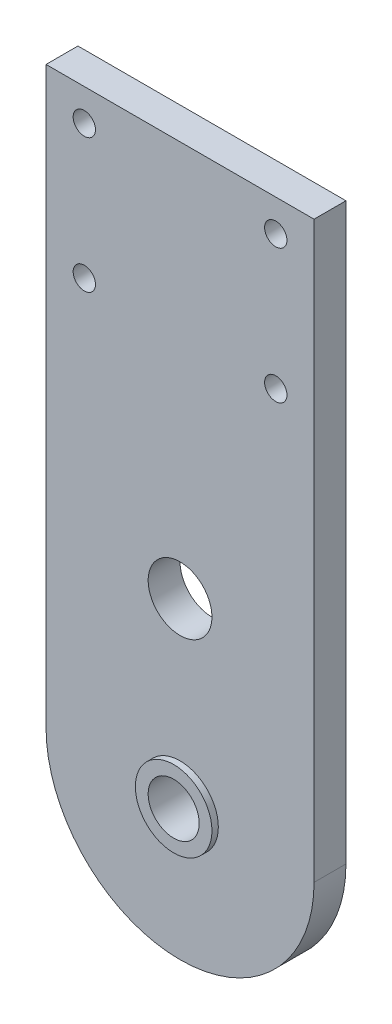
ISO-10303-21;
HEADER;
FILE_DESCRIPTION(('STEP AP214'),'2;1');
FILE_NAME('part.step','',(''),(''),'','','');
FILE_SCHEMA(('AUTOMOTIVE_DESIGN { 1 0 10303 214 1 1 1 1 }'));
ENDSEC;
DATA;
#1=APPLICATION_CONTEXT('core data for automotive mechanical design processes');
#2=APPLICATION_PROTOCOL_DEFINITION('international standard','automotive_design',2000,#1);
#3=PRODUCT_CONTEXT('',#1,'mechanical');
#4=PRODUCT('Part','Part','',(#3));
#5=PRODUCT_RELATED_PRODUCT_CATEGORY('part','',(#4));
#6=PRODUCT_DEFINITION_FORMATION('','',#4);
#7=PRODUCT_DEFINITION_CONTEXT('part definition',#1,'design');
#8=PRODUCT_DEFINITION('design','',#6,#7);
#9=PRODUCT_DEFINITION_SHAPE('','',#8);
#10=(LENGTH_UNIT() NAMED_UNIT(*) SI_UNIT(.MILLI.,.METRE.));
#11=(NAMED_UNIT(*) PLANE_ANGLE_UNIT() SI_UNIT($,.RADIAN.));
#12=(NAMED_UNIT(*) SI_UNIT($,.STERADIAN.) SOLID_ANGLE_UNIT());
#13=UNCERTAINTY_MEASURE_WITH_UNIT(LENGTH_MEASURE(1.E-05),#10,'distance_accuracy_value','');
#14=(GEOMETRIC_REPRESENTATION_CONTEXT(3) GLOBAL_UNCERTAINTY_ASSIGNED_CONTEXT((#13)) GLOBAL_UNIT_ASSIGNED_CONTEXT((#10,
#11,#12)) REPRESENTATION_CONTEXT('',''));
#15=CARTESIAN_POINT('',(0.,0.,0.));
#16=DIRECTION('',(0.,0.,1.));
#17=DIRECTION('',(1.,0.,0.));
#18=AXIS2_PLACEMENT_3D('',#15,#16,#17);
#19=CARTESIAN_POINT('',(0.,0.,5.));
#20=DIRECTION('',(0.,0.,1.));
#21=DIRECTION('',(1.,0.,0.));
#22=AXIS2_PLACEMENT_3D('',#19,#20,#21);
#23=PLANE('',#22);
#24=CARTESIAN_POINT('',(0.,0.,5.));
#25=DIRECTION('',(0.,0.,1.));
#26=DIRECTION('',(1.,0.,0.));
#27=AXIS2_PLACEMENT_3D('',#24,#25,#26);
#28=CIRCLE('',#27,21.);
#29=CARTESIAN_POINT('',(-21.,0.,5.));
#30=VERTEX_POINT('',#29);
#31=CARTESIAN_POINT('',(21.,0.,5.));
#32=VERTEX_POINT('',#31);
#33=EDGE_CURVE('E87',#30,#32,#28,.T.);
#34=ORIENTED_EDGE('',*,*,#33,.T.);
#35=DIRECTION('',(0.,1.,0.));
#36=VECTOR('',#35,1.);
#37=CARTESIAN_POINT('',(21.,0.,5.));
#38=LINE('',#37,#36);
#39=CARTESIAN_POINT('',(21.,90.,5.));
#40=VERTEX_POINT('',#39);
#41=EDGE_CURVE('E82',#32,#40,#38,.T.);
#42=ORIENTED_EDGE('',*,*,#41,.T.);
#43=DIRECTION('',(-1.,0.,0.));
#44=VECTOR('',#43,1.);
#45=CARTESIAN_POINT('',(-21.,90.,5.));
#46=LINE('',#45,#44);
#47=CARTESIAN_POINT('',(-21.,90.,5.));
#48=VERTEX_POINT('',#47);
#49=EDGE_CURVE('E85',#40,#48,#46,.T.);
#50=ORIENTED_EDGE('',*,*,#49,.T.);
#51=DIRECTION('',(0.,-1.,0.));
#52=VECTOR('',#51,1.);
#53=CARTESIAN_POINT('',(-21.,0.,5.));
#54=LINE('',#53,#52);
#55=EDGE_CURVE('E52',#48,#30,#54,.T.);
#56=ORIENTED_EDGE('',*,*,#55,.T.);
#57=EDGE_LOOP('',(#34,#42,#50,#56));
#58=FACE_BOUND('',#57,.T.);
#59=CARTESIAN_POINT('',(15.,85.,5.));
#60=DIRECTION('',(0.,0.,-1.));
#61=DIRECTION('',(-1.,0.,0.));
#62=AXIS2_PLACEMENT_3D('',#59,#60,#61);
#63=CIRCLE('',#62,1.75);
#64=CARTESIAN_POINT('',(13.25,85.,5.));
#65=VERTEX_POINT('',#64);
#66=EDGE_CURVE('E102',#65,#65,#63,.T.);
#67=ORIENTED_EDGE('',*,*,#66,.T.);
#68=EDGE_LOOP('',(#67));
#69=FACE_BOUND('',#68,.T.);
#70=CARTESIAN_POINT('',(15.,64.,5.));
#71=DIRECTION('',(0.,0.,-1.));
#72=DIRECTION('',(-1.,0.,0.));
#73=AXIS2_PLACEMENT_3D('',#70,#71,#72);
#74=CIRCLE('',#73,1.75);
#75=CARTESIAN_POINT('',(13.25,64.,5.));
#76=VERTEX_POINT('',#75);
#77=EDGE_CURVE('E116',#76,#76,#74,.T.);
#78=ORIENTED_EDGE('',*,*,#77,.T.);
#79=EDGE_LOOP('',(#78));
#80=FACE_BOUND('',#79,.T.);
#81=CARTESIAN_POINT('',(-15.,64.,5.));
#82=DIRECTION('',(0.,0.,-1.));
#83=DIRECTION('',(1.,0.,0.));
#84=AXIS2_PLACEMENT_3D('',#81,#82,#83);
#85=CIRCLE('',#84,1.75);
#86=CARTESIAN_POINT('',(-13.25,64.,5.));
#87=VERTEX_POINT('',#86);
#88=EDGE_CURVE('E122',#87,#87,#85,.T.);
#89=ORIENTED_EDGE('',*,*,#88,.T.);
#90=EDGE_LOOP('',(#89));
#91=FACE_BOUND('',#90,.T.);
#92=CARTESIAN_POINT('',(-15.,85.,5.));
#93=DIRECTION('',(0.,0.,-1.));
#94=DIRECTION('',(1.,0.,0.));
#95=AXIS2_PLACEMENT_3D('',#92,#93,#94);
#96=CIRCLE('',#95,1.75);
#97=CARTESIAN_POINT('',(-13.25,85.,5.));
#98=VERTEX_POINT('',#97);
#99=EDGE_CURVE('E128',#98,#98,#96,.T.);
#100=ORIENTED_EDGE('',*,*,#99,.T.);
#101=EDGE_LOOP('',(#100));
#102=FACE_BOUND('',#101,.T.);
#103=CARTESIAN_POINT('',(0.,28.,5.));
#104=DIRECTION('',(0.,0.,-1.));
#105=DIRECTION('',(-1.,0.,0.));
#106=AXIS2_PLACEMENT_3D('',#103,#104,#105);
#107=CIRCLE('',#106,5.);
#108=CARTESIAN_POINT('',(-5.,28.,5.));
#109=VERTEX_POINT('',#108);
#110=EDGE_CURVE('E139',#109,#109,#107,.T.);
#111=ORIENTED_EDGE('',*,*,#110,.T.);
#112=EDGE_LOOP('',(#111));
#113=FACE_BOUND('',#112,.T.);
#114=CARTESIAN_POINT('',(0.,0.,5.));
#115=DIRECTION('',(0.,0.,1.));
#116=DIRECTION('',(1.,0.,0.));
#117=AXIS2_PLACEMENT_3D('',#114,#115,#116);
#118=CIRCLE('',#117,6.);
#119=CARTESIAN_POINT('',(6.,0.,5.));
#120=VERTEX_POINT('',#119);
#121=EDGE_CURVE('E146',#120,#120,#118,.T.);
#122=ORIENTED_EDGE('',*,*,#121,.F.);
#123=EDGE_LOOP('',(#122));
#124=FACE_BOUND('',#123,.T.);
#125=ADVANCED_FACE('F35',(#58,#69,#80,#91,#102,#113,#124),#23,.T.);
#126=CARTESIAN_POINT('',(0.,0.,5.));
#127=DIRECTION('',(0.,0.,-1.));
#128=DIRECTION('',(-1.,0.,0.));
#129=AXIS2_PLACEMENT_3D('',#126,#127,#128);
#130=CYLINDRICAL_SURFACE('',#129,21.);
#131=CARTESIAN_POINT('',(0.,0.,0.));
#132=DIRECTION('',(0.,0.,1.));
#133=DIRECTION('',(1.,0.,0.));
#134=AXIS2_PLACEMENT_3D('',#131,#132,#133);
#135=CIRCLE('',#134,21.);
#136=CARTESIAN_POINT('',(-21.,0.,0.));
#137=VERTEX_POINT('',#136);
#138=CARTESIAN_POINT('',(21.,0.,0.));
#139=VERTEX_POINT('',#138);
#140=EDGE_CURVE('E99',#137,#139,#135,.T.);
#141=ORIENTED_EDGE('',*,*,#140,.T.);
#142=DIRECTION('',(0.,0.,-1.));
#143=VECTOR('',#142,1.);
#144=CARTESIAN_POINT('',(21.,0.,5.));
#145=LINE('',#144,#143);
#146=EDGE_CURVE('E11',#32,#139,#145,.T.);
#147=ORIENTED_EDGE('',*,*,#146,.F.);
#148=ORIENTED_EDGE('',*,*,#33,.F.);
#149=DIRECTION('',(0.,0.,-1.));
#150=VECTOR('',#149,1.);
#151=CARTESIAN_POINT('',(-21.,0.,5.));
#152=LINE('',#151,#150);
#153=EDGE_CURVE('E95',#30,#137,#152,.T.);
#154=ORIENTED_EDGE('',*,*,#153,.T.);
#155=EDGE_LOOP('',(#141,#147,#148,#154));
#156=FACE_BOUND('',#155,.T.);
#157=ADVANCED_FACE('F37',(#156),#130,.T.);
#158=CARTESIAN_POINT('',(21.,0.,5.));
#159=DIRECTION('',(-1.,0.,0.));
#160=DIRECTION('',(0.,0.,1.));
#161=AXIS2_PLACEMENT_3D('',#158,#159,#160);
#162=PLANE('',#161);
#163=DIRECTION('',(0.,1.,0.));
#164=VECTOR('',#163,1.);
#165=CARTESIAN_POINT('',(21.,0.,0.));
#166=LINE('',#165,#164);
#167=CARTESIAN_POINT('',(21.,90.,0.));
#168=VERTEX_POINT('',#167);
#169=EDGE_CURVE('E91',#139,#168,#166,.T.);
#170=ORIENTED_EDGE('',*,*,#169,.T.);
#171=DIRECTION('',(0.,0.,-1.));
#172=VECTOR('',#171,1.);
#173=CARTESIAN_POINT('',(21.,90.,5.));
#174=LINE('',#173,#172);
#175=EDGE_CURVE('E44',#40,#168,#174,.T.);
#176=ORIENTED_EDGE('',*,*,#175,.F.);
#177=ORIENTED_EDGE('',*,*,#41,.F.);
#178=ORIENTED_EDGE('',*,*,#146,.T.);
#179=EDGE_LOOP('',(#170,#176,#177,#178));
#180=FACE_BOUND('',#179,.T.);
#181=ADVANCED_FACE('F90',(#180),#162,.F.);
#182=CARTESIAN_POINT('',(-21.,90.,5.));
#183=DIRECTION('',(0.,-1.,0.));
#184=DIRECTION('',(0.,0.,-1.));
#185=AXIS2_PLACEMENT_3D('',#182,#183,#184);
#186=PLANE('',#185);
#187=DIRECTION('',(-1.,0.,0.));
#188=VECTOR('',#187,1.);
#189=CARTESIAN_POINT('',(-21.,90.,0.));
#190=LINE('',#189,#188);
#191=CARTESIAN_POINT('',(-21.,90.,0.));
#192=VERTEX_POINT('',#191);
#193=EDGE_CURVE('E69',#168,#192,#190,.T.);
#194=ORIENTED_EDGE('',*,*,#193,.T.);
#195=DIRECTION('',(0.,0.,-1.));
#196=VECTOR('',#195,1.);
#197=CARTESIAN_POINT('',(-21.,90.,5.));
#198=LINE('',#197,#196);
#199=EDGE_CURVE('E92',#48,#192,#198,.T.);
#200=ORIENTED_EDGE('',*,*,#199,.F.);
#201=ORIENTED_EDGE('',*,*,#49,.F.);
#202=ORIENTED_EDGE('',*,*,#175,.T.);
#203=EDGE_LOOP('',(#194,#200,#201,#202));
#204=FACE_BOUND('',#203,.T.);
#205=ADVANCED_FACE('F93',(#204),#186,.F.);
#206=CARTESIAN_POINT('',(-21.,0.,5.));
#207=DIRECTION('',(1.,0.,0.));
#208=DIRECTION('',(0.,0.,-1.));
#209=AXIS2_PLACEMENT_3D('',#206,#207,#208);
#210=PLANE('',#209);
#211=DIRECTION('',(0.,-1.,0.));
#212=VECTOR('',#211,1.);
#213=CARTESIAN_POINT('',(-21.,0.,0.));
#214=LINE('',#213,#212);
#215=EDGE_CURVE('E75',#192,#137,#214,.T.);
#216=ORIENTED_EDGE('',*,*,#215,.T.);
#217=ORIENTED_EDGE('',*,*,#153,.F.);
#218=ORIENTED_EDGE('',*,*,#55,.F.);
#219=ORIENTED_EDGE('',*,*,#199,.T.);
#220=EDGE_LOOP('',(#216,#217,#218,#219));
#221=FACE_BOUND('',#220,.T.);
#222=ADVANCED_FACE('F107',(#221),#210,.F.);
#223=CARTESIAN_POINT('',(0.,0.,0.));
#224=DIRECTION('',(0.,0.,1.));
#225=DIRECTION('',(1.,0.,0.));
#226=AXIS2_PLACEMENT_3D('',#223,#224,#225);
#227=PLANE('',#226);
#228=CARTESIAN_POINT('',(0.,28.,0.));
#229=DIRECTION('',(0.,0.,-1.));
#230=DIRECTION('',(-1.,0.,0.));
#231=AXIS2_PLACEMENT_3D('',#228,#229,#230);
#232=CIRCLE('',#231,5.);
#233=CARTESIAN_POINT('',(-5.,28.,0.));
#234=VERTEX_POINT('',#233);
#235=EDGE_CURVE('E140',#234,#234,#232,.T.);
#236=ORIENTED_EDGE('',*,*,#235,.F.);
#237=EDGE_LOOP('',(#236));
#238=FACE_BOUND('',#237,.T.);
#239=CARTESIAN_POINT('',(0.,0.,0.));
#240=DIRECTION('',(0.,0.,-1.));
#241=DIRECTION('',(-1.,0.,0.));
#242=AXIS2_PLACEMENT_3D('',#239,#240,#241);
#243=CIRCLE('',#242,4.);
#244=CARTESIAN_POINT('',(-4.,0.,0.));
#245=VERTEX_POINT('',#244);
#246=EDGE_CURVE('E134',#245,#245,#243,.T.);
#247=ORIENTED_EDGE('',*,*,#246,.F.);
#248=EDGE_LOOP('',(#247));
#249=FACE_BOUND('',#248,.T.);
#250=CARTESIAN_POINT('',(-15.,85.,0.));
#251=DIRECTION('',(0.,0.,-1.));
#252=DIRECTION('',(1.,0.,0.));
#253=AXIS2_PLACEMENT_3D('',#250,#251,#252);
#254=CIRCLE('',#253,1.75);
#255=CARTESIAN_POINT('',(-13.25,85.,0.));
#256=VERTEX_POINT('',#255);
#257=EDGE_CURVE('E131',#256,#256,#254,.T.);
#258=ORIENTED_EDGE('',*,*,#257,.F.);
#259=EDGE_LOOP('',(#258));
#260=FACE_BOUND('',#259,.T.);
#261=CARTESIAN_POINT('',(-15.,64.,0.));
#262=DIRECTION('',(0.,0.,-1.));
#263=DIRECTION('',(1.,0.,0.));
#264=AXIS2_PLACEMENT_3D('',#261,#262,#263);
#265=CIRCLE('',#264,1.75);
#266=CARTESIAN_POINT('',(-13.25,64.,0.));
#267=VERTEX_POINT('',#266);
#268=EDGE_CURVE('E125',#267,#267,#265,.T.);
#269=ORIENTED_EDGE('',*,*,#268,.F.);
#270=EDGE_LOOP('',(#269));
#271=FACE_BOUND('',#270,.T.);
#272=CARTESIAN_POINT('',(15.,64.,0.));
#273=DIRECTION('',(0.,0.,-1.));
#274=DIRECTION('',(-1.,0.,0.));
#275=AXIS2_PLACEMENT_3D('',#272,#273,#274);
#276=CIRCLE('',#275,1.75);
#277=CARTESIAN_POINT('',(13.25,64.,0.));
#278=VERTEX_POINT('',#277);
#279=EDGE_CURVE('E119',#278,#278,#276,.T.);
#280=ORIENTED_EDGE('',*,*,#279,.F.);
#281=EDGE_LOOP('',(#280));
#282=FACE_BOUND('',#281,.T.);
#283=CARTESIAN_POINT('',(15.,85.,0.));
#284=DIRECTION('',(0.,0.,-1.));
#285=DIRECTION('',(-1.,0.,0.));
#286=AXIS2_PLACEMENT_3D('',#283,#284,#285);
#287=CIRCLE('',#286,1.75);
#288=CARTESIAN_POINT('',(13.25,85.,0.));
#289=VERTEX_POINT('',#288);
#290=EDGE_CURVE('E113',#289,#289,#287,.T.);
#291=ORIENTED_EDGE('',*,*,#290,.F.);
#292=EDGE_LOOP('',(#291));
#293=FACE_BOUND('',#292,.T.);
#294=ORIENTED_EDGE('',*,*,#140,.F.);
#295=ORIENTED_EDGE('',*,*,#215,.F.);
#296=ORIENTED_EDGE('',*,*,#193,.F.);
#297=ORIENTED_EDGE('',*,*,#169,.F.);
#298=EDGE_LOOP('',(#294,#295,#296,#297));
#299=FACE_BOUND('',#298,.T.);
#300=ADVANCED_FACE('F110',(#238,#249,#260,#271,#282,#293,#299),#227,.F.);
#301=CARTESIAN_POINT('',(15.,85.,5.));
#302=DIRECTION('',(0.,0.,-1.));
#303=DIRECTION('',(-1.,0.,0.));
#304=AXIS2_PLACEMENT_3D('',#301,#302,#303);
#305=CYLINDRICAL_SURFACE('',#304,1.75);
#306=ORIENTED_EDGE('',*,*,#66,.F.);
#307=EDGE_LOOP('',(#306));
#308=FACE_BOUND('',#307,.T.);
#309=ORIENTED_EDGE('',*,*,#290,.T.);
#310=EDGE_LOOP('',(#309));
#311=FACE_BOUND('',#310,.T.);
#312=ADVANCED_FACE('F178',(#308,#311),#305,.F.);
#313=CARTESIAN_POINT('',(15.,64.,5.));
#314=DIRECTION('',(0.,0.,-1.));
#315=DIRECTION('',(-1.,0.,0.));
#316=AXIS2_PLACEMENT_3D('',#313,#314,#315);
#317=CYLINDRICAL_SURFACE('',#316,1.75);
#318=ORIENTED_EDGE('',*,*,#77,.F.);
#319=EDGE_LOOP('',(#318));
#320=FACE_BOUND('',#319,.T.);
#321=ORIENTED_EDGE('',*,*,#279,.T.);
#322=EDGE_LOOP('',(#321));
#323=FACE_BOUND('',#322,.T.);
#324=ADVANCED_FACE('F211',(#320,#323),#317,.F.);
#325=CARTESIAN_POINT('',(-15.,64.,5.));
#326=DIRECTION('',(0.,0.,-1.));
#327=DIRECTION('',(-1.,0.,0.));
#328=AXIS2_PLACEMENT_3D('',#325,#326,#327);
#329=CYLINDRICAL_SURFACE('',#328,1.75);
#330=ORIENTED_EDGE('',*,*,#88,.F.);
#331=EDGE_LOOP('',(#330));
#332=FACE_BOUND('',#331,.T.);
#333=ORIENTED_EDGE('',*,*,#268,.T.);
#334=EDGE_LOOP('',(#333));
#335=FACE_BOUND('',#334,.T.);
#336=ADVANCED_FACE('F218',(#332,#335),#329,.F.);
#337=CARTESIAN_POINT('',(-15.,85.,5.));
#338=DIRECTION('',(0.,0.,-1.));
#339=DIRECTION('',(-1.,0.,0.));
#340=AXIS2_PLACEMENT_3D('',#337,#338,#339);
#341=CYLINDRICAL_SURFACE('',#340,1.75);
#342=ORIENTED_EDGE('',*,*,#99,.F.);
#343=EDGE_LOOP('',(#342));
#344=FACE_BOUND('',#343,.T.);
#345=ORIENTED_EDGE('',*,*,#257,.T.);
#346=EDGE_LOOP('',(#345));
#347=FACE_BOUND('',#346,.T.);
#348=ADVANCED_FACE('F225',(#344,#347),#341,.F.);
#349=CARTESIAN_POINT('',(0.,0.,5.));
#350=DIRECTION('',(0.,0.,-1.));
#351=DIRECTION('',(-1.,0.,0.));
#352=AXIS2_PLACEMENT_3D('',#349,#350,#351);
#353=CYLINDRICAL_SURFACE('',#352,4.);
#354=ORIENTED_EDGE('',*,*,#246,.T.);
#355=EDGE_LOOP('',(#354));
#356=FACE_BOUND('',#355,.T.);
#357=CARTESIAN_POINT('',(0.,0.,6.));
#358=DIRECTION('',(0.,0.,1.));
#359=DIRECTION('',(1.,0.,0.));
#360=AXIS2_PLACEMENT_3D('',#357,#358,#359);
#361=CIRCLE('',#360,4.);
#362=CARTESIAN_POINT('',(4.,0.,6.));
#363=VERTEX_POINT('',#362);
#364=EDGE_CURVE('E149',#363,#363,#361,.T.);
#365=ORIENTED_EDGE('',*,*,#364,.T.);
#366=EDGE_LOOP('',(#365));
#367=FACE_BOUND('',#366,.T.);
#368=ADVANCED_FACE('F155',(#356,#367),#353,.F.);
#369=CARTESIAN_POINT('',(0.,28.,5.));
#370=DIRECTION('',(0.,0.,-1.));
#371=DIRECTION('',(-1.,0.,0.));
#372=AXIS2_PLACEMENT_3D('',#369,#370,#371);
#373=CYLINDRICAL_SURFACE('',#372,5.);
#374=ORIENTED_EDGE('',*,*,#110,.F.);
#375=EDGE_LOOP('',(#374));
#376=FACE_BOUND('',#375,.T.);
#377=ORIENTED_EDGE('',*,*,#235,.T.);
#378=EDGE_LOOP('',(#377));
#379=FACE_BOUND('',#378,.T.);
#380=ADVANCED_FACE('F160',(#376,#379),#373,.F.);
#381=CARTESIAN_POINT('',(0.,0.,6.));
#382=DIRECTION('',(0.,0.,1.));
#383=DIRECTION('',(1.,0.,0.));
#384=AXIS2_PLACEMENT_3D('',#381,#382,#383);
#385=PLANE('',#384);
#386=CARTESIAN_POINT('',(0.,0.,6.));
#387=DIRECTION('',(0.,0.,1.));
#388=DIRECTION('',(1.,0.,0.));
#389=AXIS2_PLACEMENT_3D('',#386,#387,#388);
#390=CIRCLE('',#389,6.);
#391=CARTESIAN_POINT('',(6.,0.,6.));
#392=VERTEX_POINT('',#391);
#393=EDGE_CURVE('E143',#392,#392,#390,.T.);
#394=ORIENTED_EDGE('',*,*,#393,.T.);
#395=EDGE_LOOP('',(#394));
#396=FACE_BOUND('',#395,.T.);
#397=ORIENTED_EDGE('',*,*,#364,.F.);
#398=EDGE_LOOP('',(#397));
#399=FACE_BOUND('',#398,.T.);
#400=ADVANCED_FACE('F157',(#396,#399),#385,.T.);
#401=CARTESIAN_POINT('',(0.,0.,6.));
#402=DIRECTION('',(0.,0.,-1.));
#403=DIRECTION('',(-1.,0.,0.));
#404=AXIS2_PLACEMENT_3D('',#401,#402,#403);
#405=CYLINDRICAL_SURFACE('',#404,6.);
#406=ORIENTED_EDGE('',*,*,#393,.F.);
#407=EDGE_LOOP('',(#406));
#408=FACE_BOUND('',#407,.T.);
#409=ORIENTED_EDGE('',*,*,#121,.T.);
#410=EDGE_LOOP('',(#409));
#411=FACE_BOUND('',#410,.T.);
#412=ADVANCED_FACE('F159',(#408,#411),#405,.T.);
#413=CLOSED_SHELL('',(#125,#157,#181,#205,#222,#300,#312,#324,#336,#348,#368,#380,#400,#412));
#414=MANIFOLD_SOLID_BREP('B2',#413);
#415=ADVANCED_BREP_SHAPE_REPRESENTATION('',(#18,#414),#14);
#416=SHAPE_DEFINITION_REPRESENTATION(#9,#415);
ENDSEC;
END-ISO-10303-21;
